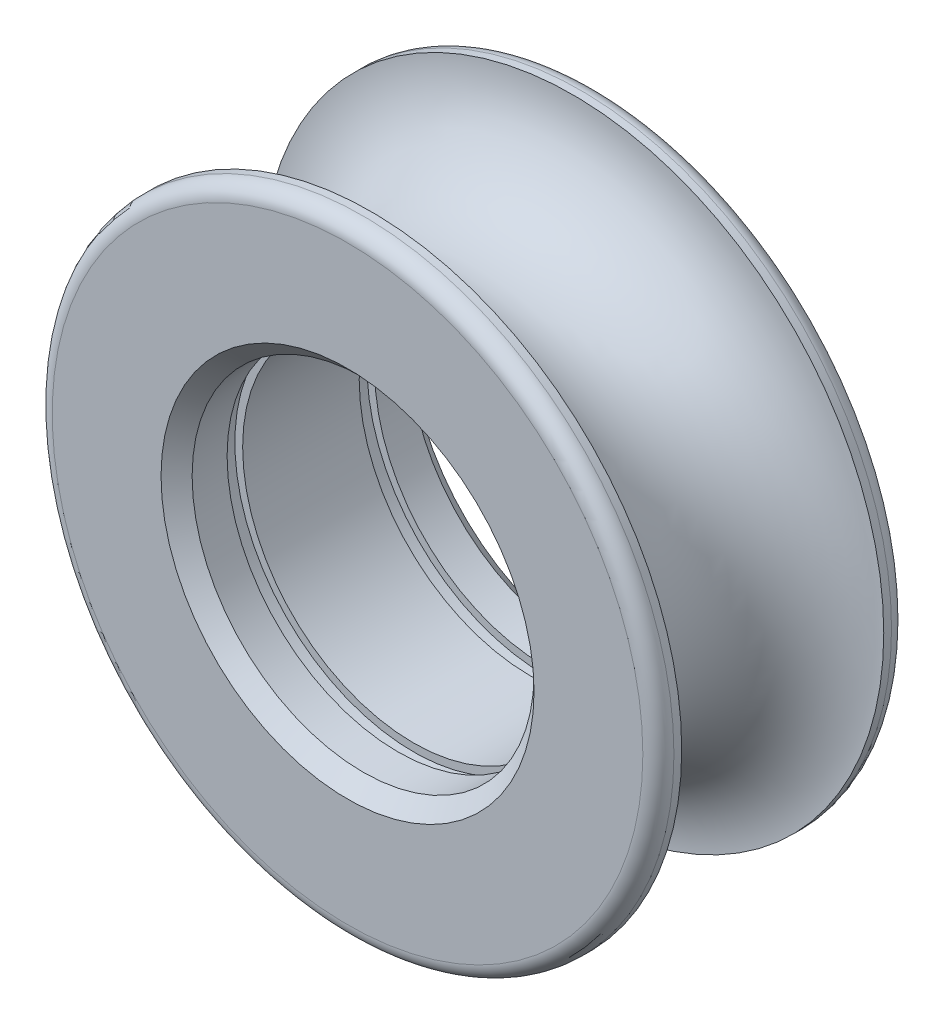
ISO-10303-21;
HEADER;
FILE_DESCRIPTION(('STEP AP214'),'2;1');
FILE_NAME('part.step','',(''),(''),'','','');
FILE_SCHEMA(('AUTOMOTIVE_DESIGN { 1 0 10303 214 1 1 1 1 }'));
ENDSEC;
DATA;
#1=APPLICATION_CONTEXT('core data for automotive mechanical design processes');
#2=APPLICATION_PROTOCOL_DEFINITION('international standard','automotive_design',2000,#1);
#3=PRODUCT_CONTEXT('',#1,'mechanical');
#4=PRODUCT('Part','Part','',(#3));
#5=PRODUCT_RELATED_PRODUCT_CATEGORY('part','',(#4));
#6=PRODUCT_DEFINITION_FORMATION('','',#4);
#7=PRODUCT_DEFINITION_CONTEXT('part definition',#1,'design');
#8=PRODUCT_DEFINITION('design','',#6,#7);
#9=PRODUCT_DEFINITION_SHAPE('','',#8);
#10=(LENGTH_UNIT() NAMED_UNIT(*) SI_UNIT(.MILLI.,.METRE.));
#11=(NAMED_UNIT(*) PLANE_ANGLE_UNIT() SI_UNIT($,.RADIAN.));
#12=(NAMED_UNIT(*) SI_UNIT($,.STERADIAN.) SOLID_ANGLE_UNIT());
#13=UNCERTAINTY_MEASURE_WITH_UNIT(LENGTH_MEASURE(1.E-05),#10,'distance_accuracy_value','');
#14=(GEOMETRIC_REPRESENTATION_CONTEXT(3) GLOBAL_UNCERTAINTY_ASSIGNED_CONTEXT((#13)) GLOBAL_UNIT_ASSIGNED_CONTEXT((#10,
#11,#12)) REPRESENTATION_CONTEXT('',''));
#15=CARTESIAN_POINT('',(0.,0.,0.));
#16=DIRECTION('',(0.,0.,1.));
#17=DIRECTION('',(1.,0.,0.));
#18=AXIS2_PLACEMENT_3D('',#15,#16,#17);
#19=CARTESIAN_POINT('',(0.,0.,0.));
#20=DIRECTION('',(0.,0.,1.));
#21=DIRECTION('',(1.,0.,0.));
#22=AXIS2_PLACEMENT_3D('',#19,#20,#21);
#23=CYLINDRICAL_SURFACE('',#22,11.143);
#24=CARTESIAN_POINT('',(0.,0.,-7.091));
#25=DIRECTION('',(0.,0.,1.));
#26=DIRECTION('',(1.,0.,0.));
#27=AXIS2_PLACEMENT_3D('',#24,#25,#26);
#28=CIRCLE('',#27,11.143);
#29=CARTESIAN_POINT('',(11.143,0.,-7.091));
#30=VERTEX_POINT('',#29);
#31=EDGE_CURVE('E56',#30,#30,#28,.T.);
#32=ORIENTED_EDGE('',*,*,#31,.F.);
#33=EDGE_LOOP('',(#32));
#34=FACE_BOUND('',#33,.T.);
#35=CARTESIAN_POINT('',(0.,0.,-4.81175));
#36=DIRECTION('',(0.,0.,1.));
#37=DIRECTION('',(1.,0.,0.));
#38=AXIS2_PLACEMENT_3D('',#35,#36,#37);
#39=CIRCLE('',#38,11.143);
#40=CARTESIAN_POINT('',(11.143,0.,-4.81175));
#41=VERTEX_POINT('',#40);
#42=EDGE_CURVE('E95',#41,#41,#39,.T.);
#43=ORIENTED_EDGE('',*,*,#42,.T.);
#44=EDGE_LOOP('',(#43));
#45=FACE_BOUND('',#44,.T.);
#46=ADVANCED_FACE('F41',(#34,#45),#23,.F.);
#47=CARTESIAN_POINT('',(0.,0.,-3.79875));
#48=DIRECTION('',(0.,0.,1.));
#49=DIRECTION('',(1.,0.,0.));
#50=AXIS2_PLACEMENT_3D('',#47,#48,#49);
#51=CIRCLE('',#50,11.143);
#52=CARTESIAN_POINT('',(11.143,0.,-3.79875));
#53=VERTEX_POINT('',#52);
#54=EDGE_CURVE('E98',#53,#53,#51,.T.);
#55=ORIENTED_EDGE('',*,*,#54,.F.);
#56=EDGE_LOOP('',(#55));
#57=FACE_BOUND('',#56,.T.);
#58=CARTESIAN_POINT('',(0.,0.,3.79875));
#59=DIRECTION('',(0.,0.,1.));
#60=DIRECTION('',(1.,0.,0.));
#61=AXIS2_PLACEMENT_3D('',#58,#59,#60);
#62=CIRCLE('',#61,11.143);
#63=CARTESIAN_POINT('',(11.143,0.,3.79875));
#64=VERTEX_POINT('',#63);
#65=EDGE_CURVE('E86',#64,#64,#62,.T.);
#66=ORIENTED_EDGE('',*,*,#65,.T.);
#67=EDGE_LOOP('',(#66));
#68=FACE_BOUND('',#67,.T.);
#69=ADVANCED_FACE('F125',(#57,#68),#23,.F.);
#70=CARTESIAN_POINT('',(0.,0.,7.091));
#71=DIRECTION('',(0.,0.,1.));
#72=DIRECTION('',(1.,0.,0.));
#73=AXIS2_PLACEMENT_3D('',#70,#71,#72);
#74=TOROIDAL_SURFACE('',#73,19.247,1.013);
#75=CARTESIAN_POINT('',(0.,0.,8.104));
#76=DIRECTION('',(0.,0.,1.));
#77=DIRECTION('',(1.,0.,0.));
#78=AXIS2_PLACEMENT_3D('',#75,#76,#77);
#79=CIRCLE('',#78,19.247);
#80=CARTESIAN_POINT('',(19.247,0.,8.104));
#81=VERTEX_POINT('',#80);
#82=EDGE_CURVE('E10',#81,#81,#79,.T.);
#83=ORIENTED_EDGE('',*,*,#82,.F.);
#84=EDGE_LOOP('',(#83));
#85=FACE_BOUND('',#84,.T.);
#86=CARTESIAN_POINT('',(0.,0.,7.09099999999999));
#87=DIRECTION('',(0.,0.,1.));
#88=DIRECTION('',(1.,0.,0.));
#89=AXIS2_PLACEMENT_3D('',#86,#87,#88);
#90=CIRCLE('',#89,20.26);
#91=CARTESIAN_POINT('',(20.26,0.,7.09099999999999));
#92=VERTEX_POINT('',#91);
#93=EDGE_CURVE('E76',#92,#92,#90,.T.);
#94=ORIENTED_EDGE('',*,*,#93,.T.);
#95=EDGE_LOOP('',(#94));
#96=FACE_BOUND('',#95,.T.);
#97=ADVANCED_FACE('F43',(#85,#96),#74,.T.);
#98=CARTESIAN_POINT('',(0.,12.156,8.104));
#99=DIRECTION('',(0.,0.,-1.));
#100=DIRECTION('',(-1.,0.,0.));
#101=AXIS2_PLACEMENT_3D('',#98,#99,#100);
#102=PLANE('',#101);
#103=CARTESIAN_POINT('',(0.,0.,8.104));
#104=DIRECTION('',(0.,0.,1.));
#105=DIRECTION('',(1.,0.,0.));
#106=AXIS2_PLACEMENT_3D('',#103,#104,#105);
#107=CIRCLE('',#106,12.156);
#108=CARTESIAN_POINT('',(12.156,0.,8.104));
#109=VERTEX_POINT('',#108);
#110=EDGE_CURVE('E48',#109,#109,#107,.T.);
#111=ORIENTED_EDGE('',*,*,#110,.F.);
#112=EDGE_LOOP('',(#111));
#113=FACE_BOUND('',#112,.T.);
#114=ORIENTED_EDGE('',*,*,#82,.T.);
#115=EDGE_LOOP('',(#114));
#116=FACE_BOUND('',#115,.T.);
#117=ADVANCED_FACE('F146',(#113,#116),#102,.F.);
#118=CARTESIAN_POINT('',(0.,0.,8.104));
#119=DIRECTION('',(0.,0.,1.));
#120=DIRECTION('',(1.,0.,0.));
#121=AXIS2_PLACEMENT_3D('',#118,#119,#120);
#122=CONICAL_SURFACE('',#121,12.156,0.785398163397449);
#123=CARTESIAN_POINT('',(0.,0.,7.091));
#124=DIRECTION('',(0.,0.,1.));
#125=DIRECTION('',(1.,0.,0.));
#126=AXIS2_PLACEMENT_3D('',#123,#124,#125);
#127=CIRCLE('',#126,11.143);
#128=CARTESIAN_POINT('',(11.143,0.,7.091));
#129=VERTEX_POINT('',#128);
#130=EDGE_CURVE('E52',#129,#129,#127,.T.);
#131=ORIENTED_EDGE('',*,*,#130,.F.);
#132=EDGE_LOOP('',(#131));
#133=FACE_BOUND('',#132,.T.);
#134=ORIENTED_EDGE('',*,*,#110,.T.);
#135=EDGE_LOOP('',(#134));
#136=FACE_BOUND('',#135,.T.);
#137=ADVANCED_FACE('F138',(#133,#136),#122,.F.);
#138=CARTESIAN_POINT('',(0.,0.,4.81175));
#139=DIRECTION('',(0.,0.,1.));
#140=DIRECTION('',(1.,0.,0.));
#141=AXIS2_PLACEMENT_3D('',#138,#139,#140);
#142=CIRCLE('',#141,11.143);
#143=CARTESIAN_POINT('',(11.143,0.,4.81175));
#144=VERTEX_POINT('',#143);
#145=EDGE_CURVE('E83',#144,#144,#142,.T.);
#146=ORIENTED_EDGE('',*,*,#145,.F.);
#147=EDGE_LOOP('',(#146));
#148=FACE_BOUND('',#147,.T.);
#149=ORIENTED_EDGE('',*,*,#130,.T.);
#150=EDGE_LOOP('',(#149));
#151=FACE_BOUND('',#150,.T.);
#152=ADVANCED_FACE('F128',(#148,#151),#23,.F.);
#153=CARTESIAN_POINT('',(0.,0.,-7.091));
#154=DIRECTION('',(0.,0.,-1.));
#155=DIRECTION('',(-1.,0.,0.));
#156=AXIS2_PLACEMENT_3D('',#153,#154,#155);
#157=CONICAL_SURFACE('',#156,11.143,0.785398163397449);
#158=CARTESIAN_POINT('',(0.,0.,-8.104));
#159=DIRECTION('',(0.,0.,1.));
#160=DIRECTION('',(1.,0.,0.));
#161=AXIS2_PLACEMENT_3D('',#158,#159,#160);
#162=CIRCLE('',#161,12.156);
#163=CARTESIAN_POINT('',(12.156,0.,-8.104));
#164=VERTEX_POINT('',#163);
#165=EDGE_CURVE('E61',#164,#164,#162,.T.);
#166=ORIENTED_EDGE('',*,*,#165,.F.);
#167=EDGE_LOOP('',(#166));
#168=FACE_BOUND('',#167,.T.);
#169=ORIENTED_EDGE('',*,*,#31,.T.);
#170=EDGE_LOOP('',(#169));
#171=FACE_BOUND('',#170,.T.);
#172=ADVANCED_FACE('F137',(#168,#171),#157,.F.);
#173=CARTESIAN_POINT('',(0.,12.156,-8.104));
#174=DIRECTION('',(0.,0.,1.));
#175=DIRECTION('',(1.,0.,0.));
#176=AXIS2_PLACEMENT_3D('',#173,#174,#175);
#177=PLANE('',#176);
#178=CARTESIAN_POINT('',(0.,0.,-8.104));
#179=DIRECTION('',(0.,0.,1.));
#180=DIRECTION('',(1.,0.,0.));
#181=AXIS2_PLACEMENT_3D('',#178,#179,#180);
#182=CIRCLE('',#181,19.247);
#183=CARTESIAN_POINT('',(19.247,0.,-8.104));
#184=VERTEX_POINT('',#183);
#185=EDGE_CURVE('E64',#184,#184,#182,.T.);
#186=ORIENTED_EDGE('',*,*,#185,.F.);
#187=EDGE_LOOP('',(#186));
#188=FACE_BOUND('',#187,.T.);
#189=ORIENTED_EDGE('',*,*,#165,.T.);
#190=EDGE_LOOP('',(#189));
#191=FACE_BOUND('',#190,.T.);
#192=ADVANCED_FACE('F144',(#188,#191),#177,.F.);
#193=CARTESIAN_POINT('',(0.,0.,-7.091));
#194=DIRECTION('',(0.,0.,1.));
#195=DIRECTION('',(1.,0.,0.));
#196=AXIS2_PLACEMENT_3D('',#193,#194,#195);
#197=TOROIDAL_SURFACE('',#196,19.247,1.013);
#198=CARTESIAN_POINT('',(0.,0.,-7.09099999999999));
#199=DIRECTION('',(0.,0.,1.));
#200=DIRECTION('',(1.,0.,0.));
#201=AXIS2_PLACEMENT_3D('',#198,#199,#200);
#202=CIRCLE('',#201,20.26);
#203=CARTESIAN_POINT('',(20.26,0.,-7.09099999999999));
#204=VERTEX_POINT('',#203);
#205=EDGE_CURVE('E67',#204,#204,#202,.T.);
#206=ORIENTED_EDGE('',*,*,#205,.F.);
#207=EDGE_LOOP('',(#206));
#208=FACE_BOUND('',#207,.T.);
#209=ORIENTED_EDGE('',*,*,#185,.T.);
#210=EDGE_LOOP('',(#209));
#211=FACE_BOUND('',#210,.T.);
#212=ADVANCED_FACE('F178',(#208,#211),#197,.T.);
#213=CARTESIAN_POINT('',(0.,0.,0.));
#214=DIRECTION('',(0.,0.,1.));
#215=DIRECTION('',(1.,0.,0.));
#216=AXIS2_PLACEMENT_3D('',#213,#214,#215);
#217=CYLINDRICAL_SURFACE('',#216,20.26);
#218=CARTESIAN_POINT('',(0.,0.,-6.5845));
#219=DIRECTION('',(0.,0.,1.));
#220=DIRECTION('',(1.,0.,0.));
#221=AXIS2_PLACEMENT_3D('',#218,#219,#220);
#222=CIRCLE('',#221,20.26);
#223=CARTESIAN_POINT('',(20.26,0.,-6.5845));
#224=VERTEX_POINT('',#223);
#225=EDGE_CURVE('E70',#224,#224,#222,.T.);
#226=ORIENTED_EDGE('',*,*,#225,.F.);
#227=EDGE_LOOP('',(#226));
#228=FACE_BOUND('',#227,.T.);
#229=ORIENTED_EDGE('',*,*,#205,.T.);
#230=EDGE_LOOP('',(#229));
#231=FACE_BOUND('',#230,.T.);
#232=ADVANCED_FACE('F174',(#228,#231),#217,.T.);
#233=CARTESIAN_POINT('',(0.,0.,0.));
#234=DIRECTION('',(0.,0.,1.));
#235=DIRECTION('',(1.,0.,0.));
#236=AXIS2_PLACEMENT_3D('',#233,#234,#235);
#237=TOROIDAL_SURFACE('',#236,20.26,6.5845);
#238=CARTESIAN_POINT('',(0.,0.,6.5845));
#239=DIRECTION('',(0.,0.,1.));
#240=DIRECTION('',(1.,0.,0.));
#241=AXIS2_PLACEMENT_3D('',#238,#239,#240);
#242=CIRCLE('',#241,20.26);
#243=CARTESIAN_POINT('',(20.26,0.,6.5845));
#244=VERTEX_POINT('',#243);
#245=EDGE_CURVE('E73',#244,#244,#242,.T.);
#246=ORIENTED_EDGE('',*,*,#245,.F.);
#247=EDGE_LOOP('',(#246));
#248=FACE_BOUND('',#247,.T.);
#249=ORIENTED_EDGE('',*,*,#225,.T.);
#250=EDGE_LOOP('',(#249));
#251=FACE_BOUND('',#250,.T.);
#252=ADVANCED_FACE('F164',(#248,#251),#237,.F.);
#253=CARTESIAN_POINT('',(0.,0.,0.));
#254=DIRECTION('',(0.,0.,1.));
#255=DIRECTION('',(1.,0.,0.));
#256=AXIS2_PLACEMENT_3D('',#253,#254,#255);
#257=CYLINDRICAL_SURFACE('',#256,20.26);
#258=ORIENTED_EDGE('',*,*,#93,.F.);
#259=EDGE_LOOP('',(#258));
#260=FACE_BOUND('',#259,.T.);
#261=ORIENTED_EDGE('',*,*,#245,.T.);
#262=EDGE_LOOP('',(#261));
#263=FACE_BOUND('',#262,.T.);
#264=ADVANCED_FACE('F155',(#260,#263),#257,.T.);
#265=CARTESIAN_POINT('',(0.,0.,4.81175));
#266=DIRECTION('',(0.,0.,1.));
#267=DIRECTION('',(1.,0.,0.));
#268=AXIS2_PLACEMENT_3D('',#265,#266,#267);
#269=PLANE('',#268);
#270=CARTESIAN_POINT('',(0.,0.,4.81175));
#271=DIRECTION('',(0.,0.,1.));
#272=DIRECTION('',(1.,0.,0.));
#273=AXIS2_PLACEMENT_3D('',#270,#271,#272);
#274=CIRCLE('',#273,11.6495);
#275=CARTESIAN_POINT('',(11.6495,0.,4.81175));
#276=VERTEX_POINT('',#275);
#277=EDGE_CURVE('E79',#276,#276,#274,.T.);
#278=ORIENTED_EDGE('',*,*,#277,.F.);
#279=EDGE_LOOP('',(#278));
#280=FACE_BOUND('',#279,.T.);
#281=ORIENTED_EDGE('',*,*,#145,.T.);
#282=EDGE_LOOP('',(#281));
#283=FACE_BOUND('',#282,.T.);
#284=ADVANCED_FACE('F152',(#280,#283),#269,.F.);
#285=CARTESIAN_POINT('',(0.,0.,3.79875));
#286=DIRECTION('',(0.,0.,1.));
#287=DIRECTION('',(1.,0.,0.));
#288=AXIS2_PLACEMENT_3D('',#285,#286,#287);
#289=PLANE('',#288);
#290=CARTESIAN_POINT('',(0.,0.,3.79875));
#291=DIRECTION('',(0.,0.,1.));
#292=DIRECTION('',(1.,0.,0.));
#293=AXIS2_PLACEMENT_3D('',#290,#291,#292);
#294=CIRCLE('',#293,11.6495);
#295=CARTESIAN_POINT('',(11.6495,0.,3.79875));
#296=VERTEX_POINT('',#295);
#297=EDGE_CURVE('E80',#296,#296,#294,.T.);
#298=ORIENTED_EDGE('',*,*,#297,.T.);
#299=EDGE_LOOP('',(#298));
#300=FACE_BOUND('',#299,.T.);
#301=ORIENTED_EDGE('',*,*,#65,.F.);
#302=EDGE_LOOP('',(#301));
#303=FACE_BOUND('',#302,.T.);
#304=ADVANCED_FACE('F154',(#300,#303),#289,.T.);
#305=CARTESIAN_POINT('',(0.,0.,4.81175));
#306=DIRECTION('',(0.,0.,-1.));
#307=DIRECTION('',(-1.,0.,0.));
#308=AXIS2_PLACEMENT_3D('',#305,#306,#307);
#309=CYLINDRICAL_SURFACE('',#308,11.6495);
#310=ORIENTED_EDGE('',*,*,#277,.T.);
#311=EDGE_LOOP('',(#310));
#312=FACE_BOUND('',#311,.T.);
#313=ORIENTED_EDGE('',*,*,#297,.F.);
#314=EDGE_LOOP('',(#313));
#315=FACE_BOUND('',#314,.T.);
#316=ADVANCED_FACE('F115',(#312,#315),#309,.F.);
#317=CARTESIAN_POINT('',(0.,0.,-4.81175));
#318=DIRECTION('',(0.,0.,1.));
#319=DIRECTION('',(1.,0.,0.));
#320=AXIS2_PLACEMENT_3D('',#317,#318,#319);
#321=CYLINDRICAL_SURFACE('',#320,11.6495);
#322=CARTESIAN_POINT('',(0.,0.,-4.81175));
#323=DIRECTION('',(0.,0.,1.));
#324=DIRECTION('',(1.,0.,0.));
#325=AXIS2_PLACEMENT_3D('',#322,#323,#324);
#326=CIRCLE('',#325,11.6495);
#327=CARTESIAN_POINT('',(11.6495,0.,-4.81175));
#328=VERTEX_POINT('',#327);
#329=EDGE_CURVE('E89',#328,#328,#326,.T.);
#330=ORIENTED_EDGE('',*,*,#329,.F.);
#331=EDGE_LOOP('',(#330));
#332=FACE_BOUND('',#331,.T.);
#333=CARTESIAN_POINT('',(0.,0.,-3.79875));
#334=DIRECTION('',(0.,0.,1.));
#335=DIRECTION('',(1.,0.,0.));
#336=AXIS2_PLACEMENT_3D('',#333,#334,#335);
#337=CIRCLE('',#336,11.6495);
#338=CARTESIAN_POINT('',(11.6495,0.,-3.79875));
#339=VERTEX_POINT('',#338);
#340=EDGE_CURVE('E92',#339,#339,#337,.T.);
#341=ORIENTED_EDGE('',*,*,#340,.T.);
#342=EDGE_LOOP('',(#341));
#343=FACE_BOUND('',#342,.T.);
#344=ADVANCED_FACE('F109',(#332,#343),#321,.F.);
#345=CARTESIAN_POINT('',(0.,0.,-4.81175));
#346=DIRECTION('',(0.,0.,1.));
#347=DIRECTION('',(1.,0.,0.));
#348=AXIS2_PLACEMENT_3D('',#345,#346,#347);
#349=PLANE('',#348);
#350=ORIENTED_EDGE('',*,*,#42,.F.);
#351=EDGE_LOOP('',(#350));
#352=FACE_BOUND('',#351,.T.);
#353=ORIENTED_EDGE('',*,*,#329,.T.);
#354=EDGE_LOOP('',(#353));
#355=FACE_BOUND('',#354,.T.);
#356=ADVANCED_FACE('F105',(#352,#355),#349,.T.);
#357=CARTESIAN_POINT('',(0.,0.,-3.79875));
#358=DIRECTION('',(0.,0.,1.));
#359=DIRECTION('',(1.,0.,0.));
#360=AXIS2_PLACEMENT_3D('',#357,#358,#359);
#361=PLANE('',#360);
#362=ORIENTED_EDGE('',*,*,#54,.T.);
#363=EDGE_LOOP('',(#362));
#364=FACE_BOUND('',#363,.T.);
#365=ORIENTED_EDGE('',*,*,#340,.F.);
#366=EDGE_LOOP('',(#365));
#367=FACE_BOUND('',#366,.T.);
#368=ADVANCED_FACE('F108',(#364,#367),#361,.F.);
#369=CLOSED_SHELL('',(#46,#69,#97,#117,#137,#152,#172,#192,#212,#232,#252,#264,#284,#304,#316,
#344,#356,#368));
#370=MANIFOLD_SOLID_BREP('B2',#369);
#371=ADVANCED_BREP_SHAPE_REPRESENTATION('',(#18,#370),#14);
#372=SHAPE_DEFINITION_REPRESENTATION(#9,#371);
ENDSEC;
END-ISO-10303-21;
